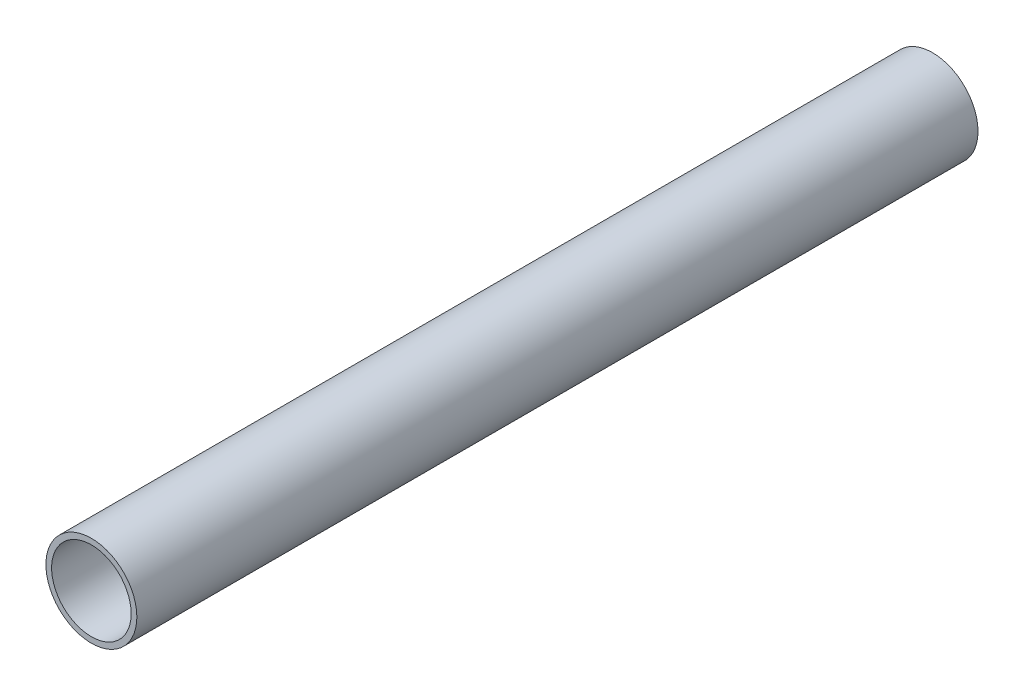
ISO-10303-21;
HEADER;
FILE_DESCRIPTION(('STEP AP214'),'2;1');
FILE_NAME('part.step','',(''),(''),'','','');
FILE_SCHEMA(('AUTOMOTIVE_DESIGN { 1 0 10303 214 1 1 1 1 }'));
ENDSEC;
DATA;
#1=APPLICATION_CONTEXT('core data for automotive mechanical design processes');
#2=APPLICATION_PROTOCOL_DEFINITION('international standard','automotive_design',2000,#1);
#3=PRODUCT_CONTEXT('',#1,'mechanical');
#4=PRODUCT('Part','Part','',(#3));
#5=PRODUCT_RELATED_PRODUCT_CATEGORY('part','',(#4));
#6=PRODUCT_DEFINITION_FORMATION('','',#4);
#7=PRODUCT_DEFINITION_CONTEXT('part definition',#1,'design');
#8=PRODUCT_DEFINITION('design','',#6,#7);
#9=PRODUCT_DEFINITION_SHAPE('','',#8);
#10=(LENGTH_UNIT() NAMED_UNIT(*) SI_UNIT(.MILLI.,.METRE.));
#11=(NAMED_UNIT(*) PLANE_ANGLE_UNIT() SI_UNIT($,.RADIAN.));
#12=(NAMED_UNIT(*) SI_UNIT($,.STERADIAN.) SOLID_ANGLE_UNIT());
#13=UNCERTAINTY_MEASURE_WITH_UNIT(LENGTH_MEASURE(1.E-05),#10,'distance_accuracy_value','');
#14=(GEOMETRIC_REPRESENTATION_CONTEXT(3) GLOBAL_UNCERTAINTY_ASSIGNED_CONTEXT((#13)) GLOBAL_UNIT_ASSIGNED_CONTEXT((#10,
#11,#12)) REPRESENTATION_CONTEXT('',''));
#15=CARTESIAN_POINT('',(0.,0.,0.));
#16=DIRECTION('',(0.,0.,1.));
#17=DIRECTION('',(1.,0.,0.));
#18=AXIS2_PLACEMENT_3D('',#15,#16,#17);
#19=CARTESIAN_POINT('',(0.,0.,18.5));
#20=DIRECTION('',(0.,0.,-1.));
#21=DIRECTION('',(-1.,0.,0.));
#22=AXIS2_PLACEMENT_3D('',#19,#20,#21);
#23=CYLINDRICAL_SURFACE('',#22,2.);
#24=CARTESIAN_POINT('',(0.,0.,18.5));
#25=DIRECTION('',(0.,0.,1.));
#26=DIRECTION('',(1.,0.,0.));
#27=AXIS2_PLACEMENT_3D('',#24,#25,#26);
#28=CIRCLE('',#27,2.);
#29=CARTESIAN_POINT('',(2.,0.,18.5));
#30=VERTEX_POINT('',#29);
#31=EDGE_CURVE('E10',#30,#30,#28,.T.);
#32=ORIENTED_EDGE('',*,*,#31,.F.);
#33=EDGE_LOOP('',(#32));
#34=FACE_BOUND('',#33,.T.);
#35=CARTESIAN_POINT('',(0.,0.,-18.5));
#36=DIRECTION('',(0.,0.,1.));
#37=DIRECTION('',(1.,0.,0.));
#38=AXIS2_PLACEMENT_3D('',#35,#36,#37);
#39=CIRCLE('',#38,2.);
#40=CARTESIAN_POINT('',(2.,0.,-18.5));
#41=VERTEX_POINT('',#40);
#42=EDGE_CURVE('E37',#41,#41,#39,.T.);
#43=ORIENTED_EDGE('',*,*,#42,.T.);
#44=EDGE_LOOP('',(#43));
#45=FACE_BOUND('',#44,.T.);
#46=ADVANCED_FACE('F40',(#34,#45),#23,.T.);
#47=CARTESIAN_POINT('',(0.,0.,18.5));
#48=DIRECTION('',(0.,0.,1.));
#49=DIRECTION('',(1.,0.,0.));
#50=AXIS2_PLACEMENT_3D('',#47,#48,#49);
#51=PLANE('',#50);
#52=CARTESIAN_POINT('',(0.,0.,18.5));
#53=DIRECTION('',(0.,0.,1.));
#54=DIRECTION('',(1.,0.,0.));
#55=AXIS2_PLACEMENT_3D('',#52,#53,#54);
#56=CIRCLE('',#55,1.75);
#57=CARTESIAN_POINT('',(1.75,0.,18.5));
#58=VERTEX_POINT('',#57);
#59=EDGE_CURVE('E47',#58,#58,#56,.T.);
#60=ORIENTED_EDGE('',*,*,#59,.F.);
#61=EDGE_LOOP('',(#60));
#62=FACE_BOUND('',#61,.T.);
#63=ORIENTED_EDGE('',*,*,#31,.T.);
#64=EDGE_LOOP('',(#63));
#65=FACE_BOUND('',#64,.T.);
#66=ADVANCED_FACE('F62',(#62,#65),#51,.T.);
#67=CARTESIAN_POINT('',(0.,0.,-18.5));
#68=DIRECTION('',(0.,0.,1.));
#69=DIRECTION('',(1.,0.,0.));
#70=AXIS2_PLACEMENT_3D('',#67,#68,#69);
#71=PLANE('',#70);
#72=CARTESIAN_POINT('',(0.,0.,-18.5));
#73=DIRECTION('',(0.,0.,1.));
#74=DIRECTION('',(1.,0.,0.));
#75=AXIS2_PLACEMENT_3D('',#72,#73,#74);
#76=CIRCLE('',#75,1.75);
#77=CARTESIAN_POINT('',(1.75,0.,-18.5));
#78=VERTEX_POINT('',#77);
#79=EDGE_CURVE('E50',#78,#78,#76,.T.);
#80=ORIENTED_EDGE('',*,*,#79,.T.);
#81=EDGE_LOOP('',(#80));
#82=FACE_BOUND('',#81,.T.);
#83=ORIENTED_EDGE('',*,*,#42,.F.);
#84=EDGE_LOOP('',(#83));
#85=FACE_BOUND('',#84,.T.);
#86=ADVANCED_FACE('F54',(#82,#85),#71,.F.);
#87=CARTESIAN_POINT('',(0.,0.,-18.5));
#88=DIRECTION('',(0.,0.,1.));
#89=DIRECTION('',(1.,0.,0.));
#90=AXIS2_PLACEMENT_3D('',#87,#88,#89);
#91=CYLINDRICAL_SURFACE('',#90,1.75);
#92=ORIENTED_EDGE('',*,*,#79,.F.);
#93=EDGE_LOOP('',(#92));
#94=FACE_BOUND('',#93,.T.);
#95=ORIENTED_EDGE('',*,*,#59,.T.);
#96=EDGE_LOOP('',(#95));
#97=FACE_BOUND('',#96,.T.);
#98=ADVANCED_FACE('F59',(#94,#97),#91,.F.);
#99=CLOSED_SHELL('',(#46,#66,#86,#98));
#100=MANIFOLD_SOLID_BREP('B2',#99);
#101=ADVANCED_BREP_SHAPE_REPRESENTATION('',(#18,#100),#14);
#102=SHAPE_DEFINITION_REPRESENTATION(#9,#101);
ENDSEC;
END-ISO-10303-21;
